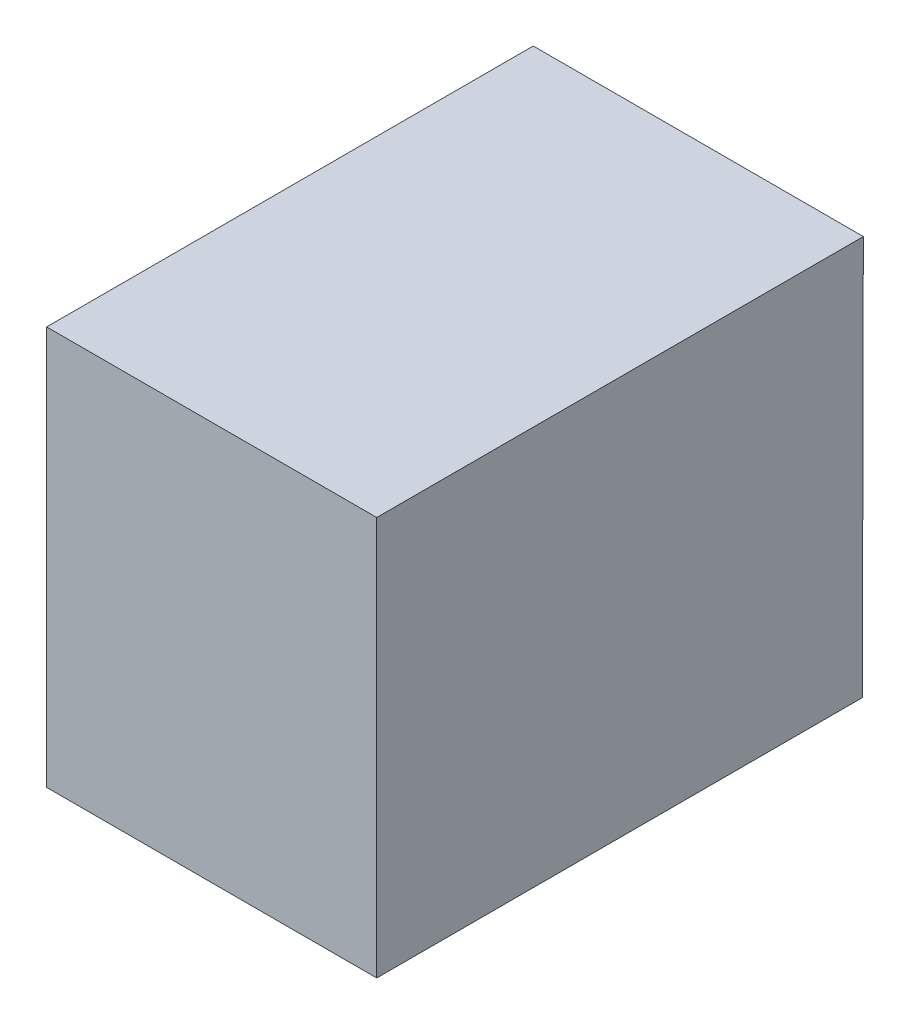
ISO-10303-21;
HEADER;
FILE_DESCRIPTION(('STEP AP214'),'2;1');
FILE_NAME('part.step','',(''),(''),'','','');
FILE_SCHEMA(('AUTOMOTIVE_DESIGN { 1 0 10303 214 1 1 1 1 }'));
ENDSEC;
DATA;
#1=APPLICATION_CONTEXT('core data for automotive mechanical design processes');
#2=APPLICATION_PROTOCOL_DEFINITION('international standard','automotive_design',2000,#1);
#3=PRODUCT_CONTEXT('',#1,'mechanical');
#4=PRODUCT('Part','Part','',(#3));
#5=PRODUCT_RELATED_PRODUCT_CATEGORY('part','',(#4));
#6=PRODUCT_DEFINITION_FORMATION('','',#4);
#7=PRODUCT_DEFINITION_CONTEXT('part definition',#1,'design');
#8=PRODUCT_DEFINITION('design','',#6,#7);
#9=PRODUCT_DEFINITION_SHAPE('','',#8);
#10=(LENGTH_UNIT() NAMED_UNIT(*) SI_UNIT(.MILLI.,.METRE.));
#11=(NAMED_UNIT(*) PLANE_ANGLE_UNIT() SI_UNIT($,.RADIAN.));
#12=(NAMED_UNIT(*) SI_UNIT($,.STERADIAN.) SOLID_ANGLE_UNIT());
#13=UNCERTAINTY_MEASURE_WITH_UNIT(LENGTH_MEASURE(1.E-05),#10,'distance_accuracy_value','');
#14=(GEOMETRIC_REPRESENTATION_CONTEXT(3) GLOBAL_UNCERTAINTY_ASSIGNED_CONTEXT((#13)) GLOBAL_UNIT_ASSIGNED_CONTEXT((#10,
#11,#12)) REPRESENTATION_CONTEXT('',''));
#15=CARTESIAN_POINT('',(0.,0.,0.));
#16=DIRECTION('',(0.,0.,1.));
#17=DIRECTION('',(1.,0.,0.));
#18=AXIS2_PLACEMENT_3D('',#15,#16,#17);
#19=CARTESIAN_POINT('',(-100.2,-54.,-68.8));
#20=DIRECTION('',(-1.,0.,0.));
#21=DIRECTION('',(0.,0.,1.));
#22=AXIS2_PLACEMENT_3D('',#19,#20,#21);
#23=PLANE('',#22);
#24=DIRECTION('',(0.,0.,1.));
#25=VECTOR('',#24,1.);
#26=CARTESIAN_POINT('',(-100.2,-6.760017689761,-68.8));
#27=LINE('',#26,#25);
#28=CARTESIAN_POINT('',(-100.2,-6.76001769025644,-12.7367436987478));
#29=VERTEX_POINT('',#28);
#30=CARTESIAN_POINT('',(-100.199999999925,-6.760017689761,-6.92509816158759));
#31=VERTEX_POINT('',#30);
#32=EDGE_CURVE('E58',#29,#31,#27,.T.);
#33=ORIENTED_EDGE('',*,*,#32,.T.);
#34=DIRECTION('',(0.,1.,0.));
#35=VECTOR('',#34,1.);
#36=CARTESIAN_POINT('',(-100.199999999699,-4.373736206096,-6.92509764656018));
#37=LINE('',#36,#35);
#38=CARTESIAN_POINT('',(-100.19999999985,-1.98749404360172,-6.92509764656018));
#39=VERTEX_POINT('',#38);
#40=EDGE_CURVE('E53',#39,#31,#37,.F.);
#41=ORIENTED_EDGE('',*,*,#40,.F.);
#42=DIRECTION('',(0.,0.,1.));
#43=VECTOR('',#42,1.);
#44=CARTESIAN_POINT('',(-100.2,-1.98749404360172,-9.836521772063));
#45=LINE('',#44,#43);
#46=CARTESIAN_POINT('',(-100.2,-1.98749404360172,-12.7480051300972));
#47=VERTEX_POINT('',#46);
#48=EDGE_CURVE('E56',#47,#39,#45,.T.);
#49=ORIENTED_EDGE('',*,*,#48,.F.);
#50=DIRECTION('',(0.,0.999997216064299,-0.00235963210075785));
#51=VECTOR('',#50,1.);
#52=CARTESIAN_POINT('',(-100.2,-6.75997386506041,-12.7367438021595));
#53=LINE('',#52,#51);
#54=EDGE_CURVE('E70',#47,#29,#53,.F.);
#55=ORIENTED_EDGE('',*,*,#54,.T.);
#56=EDGE_LOOP('',(#33,#41,#49,#55));
#57=FACE_BOUND('',#56,.T.);
#58=ADVANCED_FACE('F17',(#57),#23,.T.);
#59=CARTESIAN_POINT('',(-98.22499351073,-4.373736206096,-6.925098676619));
#60=DIRECTION('',(5.21547057833881E-07,0.,0.999999999999864));
#61=DIRECTION('',(0.999999999999864,0.,-5.21547057833881E-07));
#62=AXIS2_PLACEMENT_3D('',#59,#60,#61);
#63=PLANE('',#62);
#64=DIRECTION('',(0.999999999910854,1.3342453944418E-05,-5.21547057787458E-07));
#65=VECTOR('',#64,1.);
#66=CARTESIAN_POINT('',(-98.2249677389758,-1.98746769182474,-6.92509867663244));
#67=LINE('',#66,#65);
#68=CARTESIAN_POINT('',(-96.2500000004678,-1.98744134090865,-6.92509964944553));
#69=VERTEX_POINT('',#68);
#70=EDGE_CURVE('E20',#39,#69,#67,.T.);
#71=ORIENTED_EDGE('',*,*,#70,.F.);
#72=ORIENTED_EDGE('',*,*,#40,.T.);
#73=DIRECTION('',(1.,0.,0.));
#74=VECTOR('',#73,1.);
#75=CARTESIAN_POINT('',(-98.225,-6.760017689761,-6.925098676615));
#76=LINE('',#75,#74);
#77=CARTESIAN_POINT('',(-96.25,-6.760017689761,-6.9250991344175));
#78=VERTEX_POINT('',#77);
#79=EDGE_CURVE('E75',#31,#78,#76,.T.);
#80=ORIENTED_EDGE('',*,*,#79,.T.);
#81=DIRECTION('',(0.,1.,0.));
#82=VECTOR('',#81,1.);
#83=CARTESIAN_POINT('',(-96.25,-54.,-6.92509959222));
#84=LINE('',#83,#82);
#85=EDGE_CURVE('E74',#78,#69,#84,.T.);
#86=ORIENTED_EDGE('',*,*,#85,.T.);
#87=EDGE_LOOP('',(#71,#72,#80,#86));
#88=FACE_BOUND('',#87,.T.);
#89=ADVANCED_FACE('F72',(#88),#63,.T.);
#90=CARTESIAN_POINT('',(-98.22496925742,-1.987467691845,-9.836521772063));
#91=DIRECTION('',(-1.33424539444199E-05,0.99999999991099,0.));
#92=DIRECTION('',(-0.99999999991099,-1.33424539444199E-05,0.));
#93=AXIS2_PLACEMENT_3D('',#90,#91,#92);
#94=PLANE('',#93);
#95=DIRECTION('',(-0.99999999991099,-1.33424539444199E-05,0.));
#96=VECTOR('',#95,1.);
#97=CARTESIAN_POINT('',(-98.22496925742,-1.987467691845,-12.74800609355));
#98=LINE('',#97,#96);
#99=CARTESIAN_POINT('',(-96.2500000003119,-1.98744134090864,-12.7480056739812));
#100=VERTEX_POINT('',#99);
#101=EDGE_CURVE('E69',#100,#47,#98,.T.);
#102=ORIENTED_EDGE('',*,*,#101,.T.);
#103=ORIENTED_EDGE('',*,*,#48,.T.);
#104=ORIENTED_EDGE('',*,*,#70,.T.);
#105=DIRECTION('',(0.,0.,1.));
#106=VECTOR('',#105,1.);
#107=CARTESIAN_POINT('',(-96.2500000006238,-1.98744134090865,-9.836521772063));
#108=LINE('',#107,#106);
#109=EDGE_CURVE('E77',#69,#100,#108,.F.);
#110=ORIENTED_EDGE('',*,*,#109,.T.);
#111=EDGE_LOOP('',(#102,#103,#104,#110));
#112=FACE_BOUND('',#111,.T.);
#113=ADVANCED_FACE('F66',(#112),#94,.T.);
#114=CARTESIAN_POINT('',(-98.22492057205,-4.37372268406,-12.7423744927));
#115=DIRECTION('',(-1.11957965014814E-11,0.002359632100757,0.999997216064299));
#116=DIRECTION('',(0.,-0.999997216064299,0.002359632100757));
#117=AXIS2_PLACEMENT_3D('',#114,#115,#116);
#118=PLANE('',#117);
#119=DIRECTION('',(0.,-0.999997216064299,0.002359632100757));
#120=VECTOR('',#119,1.);
#121=CARTESIAN_POINT('',(-96.25,-4.37372268405995,-12.7423744926779));
#122=LINE('',#121,#120);
#123=CARTESIAN_POINT('',(-96.25,-6.760017689761,-12.7367436987048));
#124=VERTEX_POINT('',#123);
#125=EDGE_CURVE('E26',#100,#124,#122,.T.);
#126=ORIENTED_EDGE('',*,*,#125,.T.);
#127=DIRECTION('',(1.,0.,1.11957653331038E-11));
#128=VECTOR('',#127,1.);
#129=CARTESIAN_POINT('',(-98.22492057205,-6.76001769075182,-12.7367436987246));
#130=LINE('',#129,#128);
#131=EDGE_CURVE('E34',#124,#29,#130,.F.);
#132=ORIENTED_EDGE('',*,*,#131,.T.);
#133=ORIENTED_EDGE('',*,*,#54,.F.);
#134=ORIENTED_EDGE('',*,*,#101,.F.);
#135=EDGE_LOOP('',(#126,#132,#133,#134));
#136=FACE_BOUND('',#135,.T.);
#137=ADVANCED_FACE('F88',(#136),#118,.F.);
#138=CARTESIAN_POINT('',(-98.225,-6.760017689761,-9.830920278512));
#139=DIRECTION('',(0.,1.,0.));
#140=DIRECTION('',(0.,0.,1.));
#141=AXIS2_PLACEMENT_3D('',#138,#139,#140);
#142=PLANE('',#141);
#143=DIRECTION('',(0.,0.,1.));
#144=VECTOR('',#143,1.);
#145=CARTESIAN_POINT('',(-96.25,-6.760017689761,-9.830920278512));
#146=LINE('',#145,#144);
#147=EDGE_CURVE('E11',#124,#78,#146,.T.);
#148=ORIENTED_EDGE('',*,*,#147,.T.);
#149=ORIENTED_EDGE('',*,*,#79,.F.);
#150=ORIENTED_EDGE('',*,*,#32,.F.);
#151=ORIENTED_EDGE('',*,*,#131,.F.);
#152=EDGE_LOOP('',(#148,#149,#150,#151));
#153=FACE_BOUND('',#152,.T.);
#154=ADVANCED_FACE('F91',(#153),#142,.F.);
#155=CARTESIAN_POINT('',(-96.25,-54.,-68.8));
#156=DIRECTION('',(-1.,0.,0.));
#157=DIRECTION('',(0.,0.,1.));
#158=AXIS2_PLACEMENT_3D('',#155,#156,#157);
#159=PLANE('',#158);
#160=ORIENTED_EDGE('',*,*,#125,.F.);
#161=ORIENTED_EDGE('',*,*,#109,.F.);
#162=ORIENTED_EDGE('',*,*,#85,.F.);
#163=ORIENTED_EDGE('',*,*,#147,.F.);
#164=EDGE_LOOP('',(#160,#161,#162,#163));
#165=FACE_BOUND('',#164,.T.);
#166=ADVANCED_FACE('F90',(#165),#159,.F.);
#167=CLOSED_SHELL('',(#58,#89,#113,#137,#154,#166));
#168=MANIFOLD_SOLID_BREP('B1',#167);
#169=ADVANCED_BREP_SHAPE_REPRESENTATION('',(#18,#168),#14);
#170=SHAPE_DEFINITION_REPRESENTATION(#9,#169);
ENDSEC;
END-ISO-10303-21;
